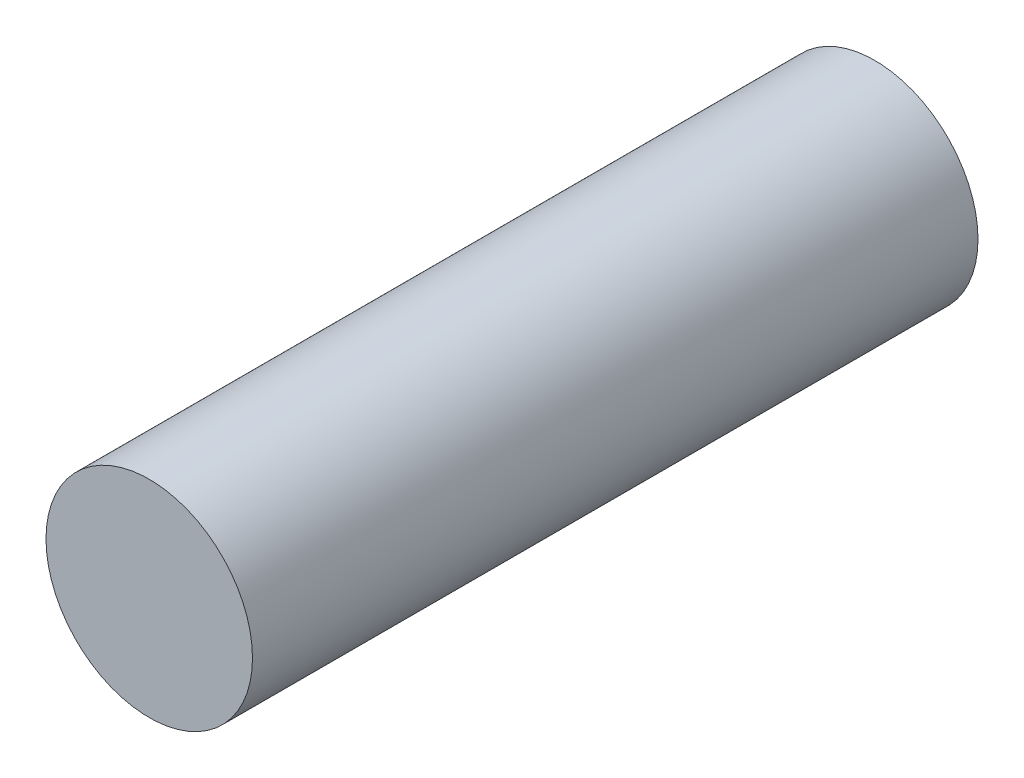
ISO-10303-21;
HEADER;
FILE_DESCRIPTION(('STEP AP214'),'2;1');
FILE_NAME('part.step','',(''),(''),'','','');
FILE_SCHEMA(('AUTOMOTIVE_DESIGN { 1 0 10303 214 1 1 1 1 }'));
ENDSEC;
DATA;
#1=APPLICATION_CONTEXT('core data for automotive mechanical design processes');
#2=APPLICATION_PROTOCOL_DEFINITION('international standard','automotive_design',2000,#1);
#3=PRODUCT_CONTEXT('',#1,'mechanical');
#4=PRODUCT('Part','Part','',(#3));
#5=PRODUCT_RELATED_PRODUCT_CATEGORY('part','',(#4));
#6=PRODUCT_DEFINITION_FORMATION('','',#4);
#7=PRODUCT_DEFINITION_CONTEXT('part definition',#1,'design');
#8=PRODUCT_DEFINITION('design','',#6,#7);
#9=PRODUCT_DEFINITION_SHAPE('','',#8);
#10=(LENGTH_UNIT() NAMED_UNIT(*) SI_UNIT(.MILLI.,.METRE.));
#11=(NAMED_UNIT(*) PLANE_ANGLE_UNIT() SI_UNIT($,.RADIAN.));
#12=(NAMED_UNIT(*) SI_UNIT($,.STERADIAN.) SOLID_ANGLE_UNIT());
#13=UNCERTAINTY_MEASURE_WITH_UNIT(LENGTH_MEASURE(1.E-05),#10,'distance_accuracy_value','');
#14=(GEOMETRIC_REPRESENTATION_CONTEXT(3) GLOBAL_UNCERTAINTY_ASSIGNED_CONTEXT((#13)) GLOBAL_UNIT_ASSIGNED_CONTEXT((#10,
#11,#12)) REPRESENTATION_CONTEXT('',''));
#15=CARTESIAN_POINT('',(0.,0.,0.));
#16=DIRECTION('',(0.,0.,1.));
#17=DIRECTION('',(1.,0.,0.));
#18=AXIS2_PLACEMENT_3D('',#15,#16,#17);
#19=CARTESIAN_POINT('',(0.,0.,65.));
#20=DIRECTION('',(0.,0.,-1.));
#21=DIRECTION('',(-1.,0.,0.));
#22=AXIS2_PLACEMENT_3D('',#19,#20,#21);
#23=CYLINDRICAL_SURFACE('',#22,9.25);
#24=CARTESIAN_POINT('',(0.,0.,65.));
#25=DIRECTION('',(0.,0.,1.));
#26=DIRECTION('',(1.,0.,0.));
#27=AXIS2_PLACEMENT_3D('',#24,#25,#26);
#28=CIRCLE('',#27,9.25);
#29=CARTESIAN_POINT('',(9.25,0.,65.));
#30=VERTEX_POINT('',#29);
#31=EDGE_CURVE('E10',#30,#30,#28,.T.);
#32=ORIENTED_EDGE('',*,*,#31,.F.);
#33=EDGE_LOOP('',(#32));
#34=FACE_BOUND('',#33,.T.);
#35=CARTESIAN_POINT('',(0.,0.,0.));
#36=DIRECTION('',(0.,0.,1.));
#37=DIRECTION('',(1.,0.,0.));
#38=AXIS2_PLACEMENT_3D('',#35,#36,#37);
#39=CIRCLE('',#38,9.25);
#40=CARTESIAN_POINT('',(9.25,0.,0.));
#41=VERTEX_POINT('',#40);
#42=EDGE_CURVE('E34',#41,#41,#39,.T.);
#43=ORIENTED_EDGE('',*,*,#42,.T.);
#44=EDGE_LOOP('',(#43));
#45=FACE_BOUND('',#44,.T.);
#46=ADVANCED_FACE('F31',(#34,#45),#23,.T.);
#47=CARTESIAN_POINT('',(0.,0.,65.));
#48=DIRECTION('',(0.,0.,1.));
#49=DIRECTION('',(1.,0.,0.));
#50=AXIS2_PLACEMENT_3D('',#47,#48,#49);
#51=PLANE('',#50);
#52=ORIENTED_EDGE('',*,*,#31,.T.);
#53=EDGE_LOOP('',(#52));
#54=FACE_BOUND('',#53,.T.);
#55=ADVANCED_FACE('F46',(#54),#51,.T.);
#56=CARTESIAN_POINT('',(0.,0.,0.));
#57=DIRECTION('',(0.,0.,1.));
#58=DIRECTION('',(1.,0.,0.));
#59=AXIS2_PLACEMENT_3D('',#56,#57,#58);
#60=PLANE('',#59);
#61=ORIENTED_EDGE('',*,*,#42,.F.);
#62=EDGE_LOOP('',(#61));
#63=FACE_BOUND('',#62,.T.);
#64=ADVANCED_FACE('F44',(#63),#60,.F.);
#65=CLOSED_SHELL('',(#46,#55,#64));
#66=MANIFOLD_SOLID_BREP('B2',#65);
#67=ADVANCED_BREP_SHAPE_REPRESENTATION('',(#18,#66),#14);
#68=SHAPE_DEFINITION_REPRESENTATION(#9,#67);
ENDSEC;
END-ISO-10303-21;
